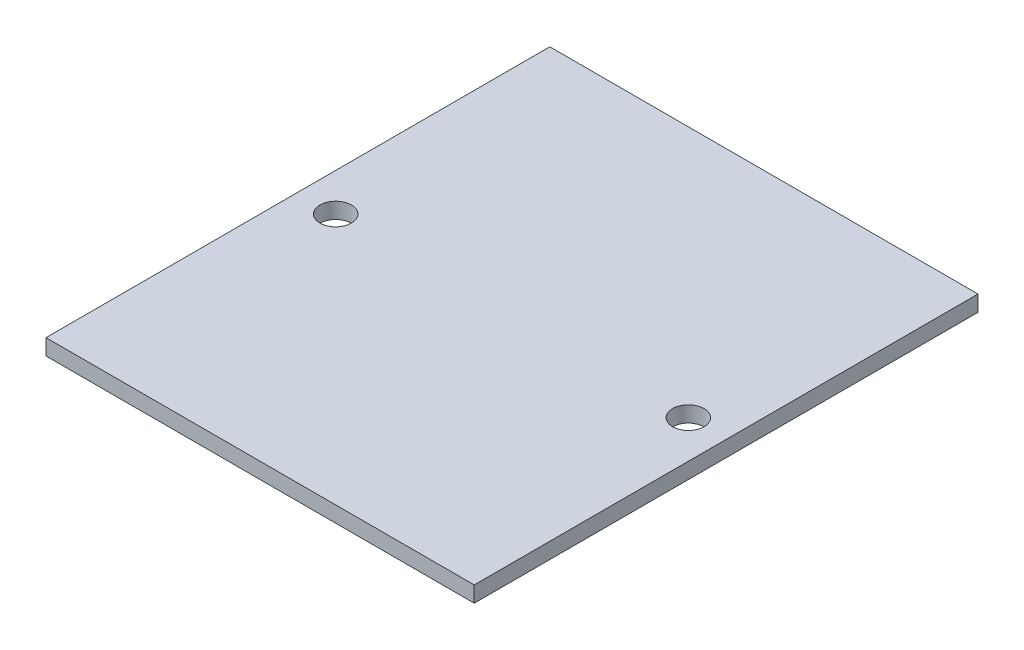
ISO-10303-21;
HEADER;
FILE_DESCRIPTION(('STEP AP214'),'2;1');
FILE_NAME('part.step','',(''),(''),'','','');
FILE_SCHEMA(('AUTOMOTIVE_DESIGN { 1 0 10303 214 1 1 1 1 }'));
ENDSEC;
DATA;
#1=APPLICATION_CONTEXT('core data for automotive mechanical design processes');
#2=APPLICATION_PROTOCOL_DEFINITION('international standard','automotive_design',2000,#1);
#3=PRODUCT_CONTEXT('',#1,'mechanical');
#4=PRODUCT('Part','Part','',(#3));
#5=PRODUCT_RELATED_PRODUCT_CATEGORY('part','',(#4));
#6=PRODUCT_DEFINITION_FORMATION('','',#4);
#7=PRODUCT_DEFINITION_CONTEXT('part definition',#1,'design');
#8=PRODUCT_DEFINITION('design','',#6,#7);
#9=PRODUCT_DEFINITION_SHAPE('','',#8);
#10=(LENGTH_UNIT() NAMED_UNIT(*) SI_UNIT(.MILLI.,.METRE.));
#11=(NAMED_UNIT(*) PLANE_ANGLE_UNIT() SI_UNIT($,.RADIAN.));
#12=(NAMED_UNIT(*) SI_UNIT($,.STERADIAN.) SOLID_ANGLE_UNIT());
#13=UNCERTAINTY_MEASURE_WITH_UNIT(LENGTH_MEASURE(1.E-05),#10,'distance_accuracy_value','');
#14=(GEOMETRIC_REPRESENTATION_CONTEXT(3) GLOBAL_UNCERTAINTY_ASSIGNED_CONTEXT((#13)) GLOBAL_UNIT_ASSIGNED_CONTEXT((#10,
#11,#12)) REPRESENTATION_CONTEXT('',''));
#15=CARTESIAN_POINT('',(0.,0.,0.));
#16=DIRECTION('',(0.,0.,1.));
#17=DIRECTION('',(1.,0.,0.));
#18=AXIS2_PLACEMENT_3D('',#15,#16,#17);
#19=CARTESIAN_POINT('',(0.,1.6002,0.));
#20=DIRECTION('',(0.,-1.,0.));
#21=DIRECTION('',(0.,0.,-1.));
#22=AXIS2_PLACEMENT_3D('',#19,#20,#21);
#23=PLANE('',#22);
#24=DIRECTION('',(0.,0.,-1.));
#25=VECTOR('',#24,1.);
#26=CARTESIAN_POINT('',(21.59,1.6002,25.4));
#27=LINE('',#26,#25);
#28=CARTESIAN_POINT('',(21.59,1.6002,25.4));
#29=VERTEX_POINT('',#28);
#30=CARTESIAN_POINT('',(21.59,1.6002,-25.4));
#31=VERTEX_POINT('',#30);
#32=EDGE_CURVE('E85',#29,#31,#27,.T.);
#33=ORIENTED_EDGE('',*,*,#32,.T.);
#34=DIRECTION('',(-1.,0.,0.));
#35=VECTOR('',#34,1.);
#36=CARTESIAN_POINT('',(-21.59,1.6002,-25.4));
#37=LINE('',#36,#35);
#38=CARTESIAN_POINT('',(-21.59,1.6002,-25.4));
#39=VERTEX_POINT('',#38);
#40=EDGE_CURVE('E80',#31,#39,#37,.T.);
#41=ORIENTED_EDGE('',*,*,#40,.T.);
#42=DIRECTION('',(0.,0.,1.));
#43=VECTOR('',#42,1.);
#44=CARTESIAN_POINT('',(-21.59,1.6002,25.4));
#45=LINE('',#44,#43);
#46=CARTESIAN_POINT('',(-21.59,1.6002,25.4));
#47=VERTEX_POINT('',#46);
#48=EDGE_CURVE('E83',#39,#47,#45,.T.);
#49=ORIENTED_EDGE('',*,*,#48,.T.);
#50=DIRECTION('',(1.,0.,0.));
#51=VECTOR('',#50,1.);
#52=CARTESIAN_POINT('',(-21.59,1.6002,25.4));
#53=LINE('',#52,#51);
#54=EDGE_CURVE('E50',#47,#29,#53,.T.);
#55=ORIENTED_EDGE('',*,*,#54,.T.);
#56=EDGE_LOOP('',(#33,#41,#49,#55));
#57=FACE_BOUND('',#56,.T.);
#58=CARTESIAN_POINT('',(-17.78,1.6002,0.));
#59=DIRECTION('',(0.,1.,0.));
#60=DIRECTION('',(0.,0.,1.));
#61=AXIS2_PLACEMENT_3D('',#58,#59,#60);
#62=CIRCLE('',#61,1.5875);
#63=CARTESIAN_POINT('',(-17.78,1.6002,1.5875));
#64=VERTEX_POINT('',#63);
#65=EDGE_CURVE('E100',#64,#64,#62,.T.);
#66=ORIENTED_EDGE('',*,*,#65,.F.);
#67=EDGE_LOOP('',(#66));
#68=FACE_BOUND('',#67,.T.);
#69=CARTESIAN_POINT('',(17.78,1.6002,0.));
#70=DIRECTION('',(0.,1.,0.));
#71=DIRECTION('',(0.,0.,1.));
#72=AXIS2_PLACEMENT_3D('',#69,#70,#71);
#73=CIRCLE('',#72,1.5875);
#74=CARTESIAN_POINT('',(17.78,1.6002,1.58749999999999));
#75=VERTEX_POINT('',#74);
#76=EDGE_CURVE('E115',#75,#75,#73,.T.);
#77=ORIENTED_EDGE('',*,*,#76,.F.);
#78=EDGE_LOOP('',(#77));
#79=FACE_BOUND('',#78,.T.);
#80=ADVANCED_FACE('F33',(#57,#68,#79),#23,.F.);
#81=CARTESIAN_POINT('',(0.,0.,0.));
#82=DIRECTION('',(0.,-1.,0.));
#83=DIRECTION('',(0.,0.,-1.));
#84=AXIS2_PLACEMENT_3D('',#81,#82,#83);
#85=PLANE('',#84);
#86=CARTESIAN_POINT('',(-17.78,0.,0.));
#87=DIRECTION('',(0.,1.,0.));
#88=DIRECTION('',(0.,0.,1.));
#89=AXIS2_PLACEMENT_3D('',#86,#87,#88);
#90=CIRCLE('',#89,1.5875);
#91=CARTESIAN_POINT('',(-17.78,0.,1.5875));
#92=VERTEX_POINT('',#91);
#93=EDGE_CURVE('E112',#92,#92,#90,.T.);
#94=ORIENTED_EDGE('',*,*,#93,.T.);
#95=EDGE_LOOP('',(#94));
#96=FACE_BOUND('',#95,.T.);
#97=DIRECTION('',(0.,0.,-1.));
#98=VECTOR('',#97,1.);
#99=CARTESIAN_POINT('',(21.59,0.,25.4));
#100=LINE('',#99,#98);
#101=CARTESIAN_POINT('',(21.59,0.,25.4));
#102=VERTEX_POINT('',#101);
#103=CARTESIAN_POINT('',(21.59,0.,-25.4));
#104=VERTEX_POINT('',#103);
#105=EDGE_CURVE('E97',#102,#104,#100,.T.);
#106=ORIENTED_EDGE('',*,*,#105,.F.);
#107=DIRECTION('',(1.,0.,0.));
#108=VECTOR('',#107,1.);
#109=CARTESIAN_POINT('',(-21.59,0.,25.4));
#110=LINE('',#109,#108);
#111=CARTESIAN_POINT('',(-21.59,0.,25.4));
#112=VERTEX_POINT('',#111);
#113=EDGE_CURVE('E73',#112,#102,#110,.T.);
#114=ORIENTED_EDGE('',*,*,#113,.F.);
#115=DIRECTION('',(0.,0.,1.));
#116=VECTOR('',#115,1.);
#117=CARTESIAN_POINT('',(-21.59,0.,25.4));
#118=LINE('',#117,#116);
#119=CARTESIAN_POINT('',(-21.59,0.,-25.4));
#120=VERTEX_POINT('',#119);
#121=EDGE_CURVE('E67',#120,#112,#118,.T.);
#122=ORIENTED_EDGE('',*,*,#121,.F.);
#123=DIRECTION('',(-1.,0.,0.));
#124=VECTOR('',#123,1.);
#125=CARTESIAN_POINT('',(-21.59,0.,-25.4));
#126=LINE('',#125,#124);
#127=EDGE_CURVE('E89',#104,#120,#126,.T.);
#128=ORIENTED_EDGE('',*,*,#127,.F.);
#129=EDGE_LOOP('',(#106,#114,#122,#128));
#130=FACE_BOUND('',#129,.T.);
#131=CARTESIAN_POINT('',(17.78,0.,0.));
#132=DIRECTION('',(0.,1.,0.));
#133=DIRECTION('',(0.,0.,1.));
#134=AXIS2_PLACEMENT_3D('',#131,#132,#133);
#135=CIRCLE('',#134,1.5875);
#136=CARTESIAN_POINT('',(17.78,0.,1.58749999999999));
#137=VERTEX_POINT('',#136);
#138=EDGE_CURVE('E118',#137,#137,#135,.T.);
#139=ORIENTED_EDGE('',*,*,#138,.T.);
#140=EDGE_LOOP('',(#139));
#141=FACE_BOUND('',#140,.T.);
#142=ADVANCED_FACE('F108',(#96,#130,#141),#85,.T.);
#143=CARTESIAN_POINT('',(21.59,1.6002,25.4));
#144=DIRECTION('',(-1.,0.,0.));
#145=DIRECTION('',(0.,0.,1.));
#146=AXIS2_PLACEMENT_3D('',#143,#144,#145);
#147=PLANE('',#146);
#148=ORIENTED_EDGE('',*,*,#105,.T.);
#149=DIRECTION('',(0.,-1.,0.));
#150=VECTOR('',#149,1.);
#151=CARTESIAN_POINT('',(21.59,1.6002,-25.4));
#152=LINE('',#151,#150);
#153=EDGE_CURVE('E11',#31,#104,#152,.T.);
#154=ORIENTED_EDGE('',*,*,#153,.F.);
#155=ORIENTED_EDGE('',*,*,#32,.F.);
#156=DIRECTION('',(0.,-1.,0.));
#157=VECTOR('',#156,1.);
#158=CARTESIAN_POINT('',(21.59,1.6002,25.4));
#159=LINE('',#158,#157);
#160=EDGE_CURVE('E93',#29,#102,#159,.T.);
#161=ORIENTED_EDGE('',*,*,#160,.T.);
#162=EDGE_LOOP('',(#148,#154,#155,#161));
#163=FACE_BOUND('',#162,.T.);
#164=ADVANCED_FACE('F35',(#163),#147,.F.);
#165=CARTESIAN_POINT('',(-21.59,1.6002,-25.4));
#166=DIRECTION('',(0.,0.,1.));
#167=DIRECTION('',(1.,0.,0.));
#168=AXIS2_PLACEMENT_3D('',#165,#166,#167);
#169=PLANE('',#168);
#170=ORIENTED_EDGE('',*,*,#127,.T.);
#171=DIRECTION('',(0.,-1.,0.));
#172=VECTOR('',#171,1.);
#173=CARTESIAN_POINT('',(-21.59,1.6002,-25.4));
#174=LINE('',#173,#172);
#175=EDGE_CURVE('E42',#39,#120,#174,.T.);
#176=ORIENTED_EDGE('',*,*,#175,.F.);
#177=ORIENTED_EDGE('',*,*,#40,.F.);
#178=ORIENTED_EDGE('',*,*,#153,.T.);
#179=EDGE_LOOP('',(#170,#176,#177,#178));
#180=FACE_BOUND('',#179,.T.);
#181=ADVANCED_FACE('F88',(#180),#169,.F.);
#182=CARTESIAN_POINT('',(-21.59,1.6002,25.4));
#183=DIRECTION('',(1.,0.,0.));
#184=DIRECTION('',(0.,0.,-1.));
#185=AXIS2_PLACEMENT_3D('',#182,#183,#184);
#186=PLANE('',#185);
#187=ORIENTED_EDGE('',*,*,#121,.T.);
#188=DIRECTION('',(0.,-1.,0.));
#189=VECTOR('',#188,1.);
#190=CARTESIAN_POINT('',(-21.59,1.6002,25.4));
#191=LINE('',#190,#189);
#192=EDGE_CURVE('E90',#47,#112,#191,.T.);
#193=ORIENTED_EDGE('',*,*,#192,.F.);
#194=ORIENTED_EDGE('',*,*,#48,.F.);
#195=ORIENTED_EDGE('',*,*,#175,.T.);
#196=EDGE_LOOP('',(#187,#193,#194,#195));
#197=FACE_BOUND('',#196,.T.);
#198=ADVANCED_FACE('F91',(#197),#186,.F.);
#199=CARTESIAN_POINT('',(-21.59,1.6002,25.4));
#200=DIRECTION('',(0.,0.,-1.));
#201=DIRECTION('',(-1.,0.,0.));
#202=AXIS2_PLACEMENT_3D('',#199,#200,#201);
#203=PLANE('',#202);
#204=ORIENTED_EDGE('',*,*,#113,.T.);
#205=ORIENTED_EDGE('',*,*,#160,.F.);
#206=ORIENTED_EDGE('',*,*,#54,.F.);
#207=ORIENTED_EDGE('',*,*,#192,.T.);
#208=EDGE_LOOP('',(#204,#205,#206,#207));
#209=FACE_BOUND('',#208,.T.);
#210=ADVANCED_FACE('F105',(#209),#203,.F.);
#211=CARTESIAN_POINT('',(-17.78,1.6002,0.));
#212=DIRECTION('',(0.,-1.,0.));
#213=DIRECTION('',(0.,0.,-1.));
#214=AXIS2_PLACEMENT_3D('',#211,#212,#213);
#215=CYLINDRICAL_SURFACE('',#214,1.5875);
#216=ORIENTED_EDGE('',*,*,#65,.T.);
#217=EDGE_LOOP('',(#216));
#218=FACE_BOUND('',#217,.T.);
#219=ORIENTED_EDGE('',*,*,#93,.F.);
#220=EDGE_LOOP('',(#219));
#221=FACE_BOUND('',#220,.T.);
#222=ADVANCED_FACE('F135',(#218,#221),#215,.F.);
#223=CARTESIAN_POINT('',(17.78,1.6002,0.));
#224=DIRECTION('',(0.,-1.,0.));
#225=DIRECTION('',(0.,0.,-1.));
#226=AXIS2_PLACEMENT_3D('',#223,#224,#225);
#227=CYLINDRICAL_SURFACE('',#226,1.5875);
#228=ORIENTED_EDGE('',*,*,#76,.T.);
#229=EDGE_LOOP('',(#228));
#230=FACE_BOUND('',#229,.T.);
#231=ORIENTED_EDGE('',*,*,#138,.F.);
#232=EDGE_LOOP('',(#231));
#233=FACE_BOUND('',#232,.T.);
#234=ADVANCED_FACE('F124',(#230,#233),#227,.F.);
#235=CLOSED_SHELL('',(#80,#142,#164,#181,#198,#210,#222,#234));
#236=MANIFOLD_SOLID_BREP('B2',#235);
#237=ADVANCED_BREP_SHAPE_REPRESENTATION('',(#18,#236),#14);
#238=SHAPE_DEFINITION_REPRESENTATION(#9,#237);
ENDSEC;
END-ISO-10303-21;
